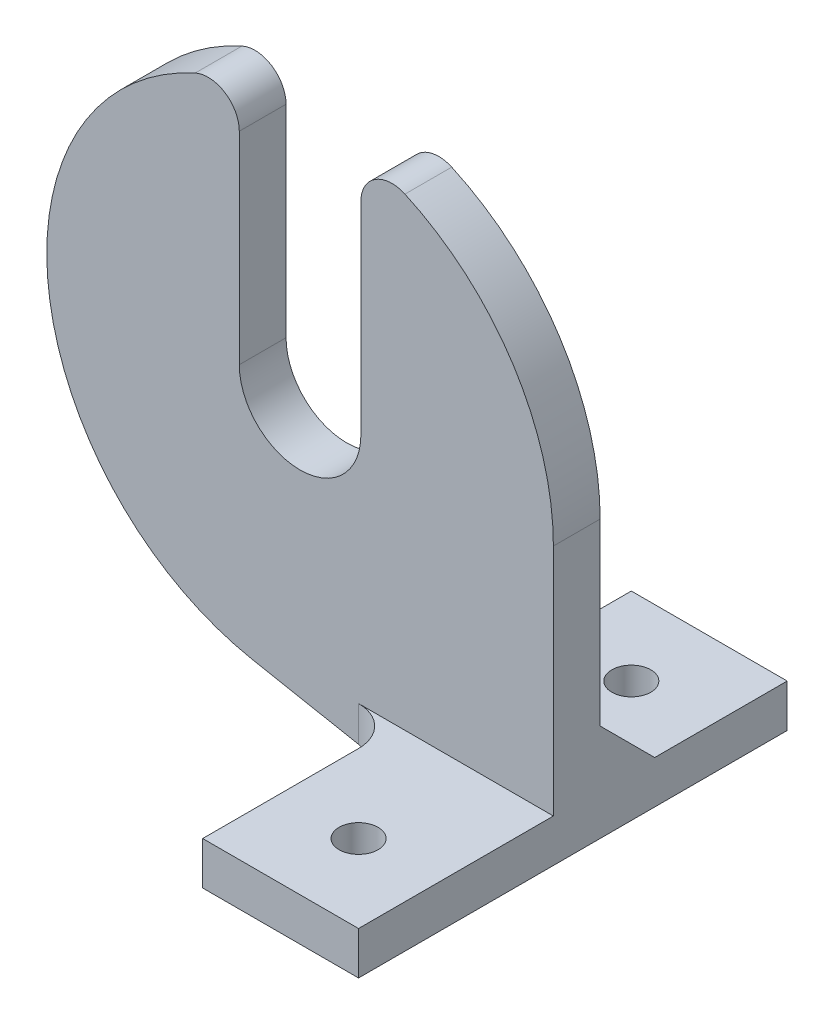
ISO-10303-21;
HEADER;
FILE_DESCRIPTION(('STEP AP214'),'2;1');
FILE_NAME('part.step','',(''),(''),'','','');
FILE_SCHEMA(('AUTOMOTIVE_DESIGN { 1 0 10303 214 1 1 1 1 }'));
ENDSEC;
DATA;
#1=APPLICATION_CONTEXT('core data for automotive mechanical design processes');
#2=APPLICATION_PROTOCOL_DEFINITION('international standard','automotive_design',2000,#1);
#3=PRODUCT_CONTEXT('',#1,'mechanical');
#4=PRODUCT('Part','Part','',(#3));
#5=PRODUCT_RELATED_PRODUCT_CATEGORY('part','',(#4));
#6=PRODUCT_DEFINITION_FORMATION('','',#4);
#7=PRODUCT_DEFINITION_CONTEXT('part definition',#1,'design');
#8=PRODUCT_DEFINITION('design','',#6,#7);
#9=PRODUCT_DEFINITION_SHAPE('','',#8);
#10=(LENGTH_UNIT() NAMED_UNIT(*) SI_UNIT(.MILLI.,.METRE.));
#11=(NAMED_UNIT(*) PLANE_ANGLE_UNIT() SI_UNIT($,.RADIAN.));
#12=(NAMED_UNIT(*) SI_UNIT($,.STERADIAN.) SOLID_ANGLE_UNIT());
#13=UNCERTAINTY_MEASURE_WITH_UNIT(LENGTH_MEASURE(1.E-05),#10,'distance_accuracy_value','');
#14=(GEOMETRIC_REPRESENTATION_CONTEXT(3) GLOBAL_UNCERTAINTY_ASSIGNED_CONTEXT((#13)) GLOBAL_UNIT_ASSIGNED_CONTEXT((#10,
#11,#12)) REPRESENTATION_CONTEXT('',''));
#15=CARTESIAN_POINT('',(0.,0.,0.));
#16=DIRECTION('',(0.,0.,1.));
#17=DIRECTION('',(1.,0.,0.));
#18=AXIS2_PLACEMENT_3D('',#15,#16,#17);
#19=CARTESIAN_POINT('',(0.,0.,7.62));
#20=DIRECTION('',(0.,0.,-1.));
#21=DIRECTION('',(-1.,0.,0.));
#22=AXIS2_PLACEMENT_3D('',#19,#20,#21);
#23=CYLINDRICAL_SURFACE('',#22,41.275);
#24=CARTESIAN_POINT('',(0.,0.,7.62));
#25=DIRECTION('',(0.,0.,1.));
#26=DIRECTION('',(1.,0.,0.));
#27=AXIS2_PLACEMENT_3D('',#24,#25,#26);
#28=CIRCLE('',#27,41.275);
#29=CARTESIAN_POINT('',(-17.089298245614,37.571019555935,7.62));
#30=VERTEX_POINT('',#29);
#31=CARTESIAN_POINT('',(-7.79603534004595,-40.5320546971993,7.62));
#32=VERTEX_POINT('',#31);
#33=EDGE_CURVE('E222',#30,#32,#28,.T.);
#34=ORIENTED_EDGE('',*,*,#33,.F.);
#35=DIRECTION('',(0.,0.,-1.));
#36=VECTOR('',#35,1.);
#37=CARTESIAN_POINT('',(-17.089298245614,37.571019555935,7.62));
#38=LINE('',#37,#36);
#39=CARTESIAN_POINT('',(-17.089298245614,37.571019555935,0.));
#40=VERTEX_POINT('',#39);
#41=EDGE_CURVE('E42',#30,#40,#38,.T.);
#42=ORIENTED_EDGE('',*,*,#41,.T.);
#43=CARTESIAN_POINT('',(0.,0.,0.));
#44=DIRECTION('',(0.,0.,1.));
#45=DIRECTION('',(1.,0.,0.));
#46=AXIS2_PLACEMENT_3D('',#43,#44,#45);
#47=CIRCLE('',#46,41.275);
#48=CARTESIAN_POINT('',(-7.79603534004595,-40.5320546971993,0.));
#49=VERTEX_POINT('',#48);
#50=EDGE_CURVE('E235',#40,#49,#47,.T.);
#51=ORIENTED_EDGE('',*,*,#50,.T.);
#52=DIRECTION('',(0.,0.,1.));
#53=VECTOR('',#52,1.);
#54=CARTESIAN_POINT('',(-7.79603534004595,-40.5320546971993,0.));
#55=LINE('',#54,#53);
#56=EDGE_CURVE('E186',#49,#32,#55,.T.);
#57=ORIENTED_EDGE('',*,*,#56,.T.);
#58=EDGE_LOOP('',(#34,#42,#51,#57));
#59=FACE_BOUND('',#58,.T.);
#60=ADVANCED_FACE('F34',(#59),#23,.T.);
#61=CARTESIAN_POINT('',(15.875,-38.1,-30.48));
#62=DIRECTION('',(-1.,0.,0.));
#63=DIRECTION('',(0.,0.,1.));
#64=AXIS2_PLACEMENT_3D('',#61,#62,#63);
#65=PLANE('',#64);
#66=DIRECTION('',(0.,0.,1.));
#67=VECTOR('',#66,1.);
#68=CARTESIAN_POINT('',(15.875,-45.085,-30.48));
#69=LINE('',#68,#67);
#70=CARTESIAN_POINT('',(15.875,-45.085,-30.48));
#71=VERTEX_POINT('',#70);
#72=CARTESIAN_POINT('',(15.875,-45.085,-6.35));
#73=VERTEX_POINT('',#72);
#74=EDGE_CURVE('E206',#71,#73,#69,.T.);
#75=ORIENTED_EDGE('',*,*,#74,.T.);
#76=DIRECTION('',(0.,1.,0.));
#77=VECTOR('',#76,1.);
#78=CARTESIAN_POINT('',(15.875,-29.2100000000001,-6.35));
#79=LINE('',#78,#77);
#80=CARTESIAN_POINT('',(15.875,-35.56,-6.35));
#81=VERTEX_POINT('',#80);
#82=EDGE_CURVE('E271',#73,#81,#79,.T.);
#83=ORIENTED_EDGE('',*,*,#82,.T.);
#84=DIRECTION('',(0.,0.707106781186544,0.707106781186551));
#85=VECTOR('',#84,1.);
#86=CARTESIAN_POINT('',(15.875,-38.1,-8.89000000000004));
#87=LINE('',#86,#85);
#88=CARTESIAN_POINT('',(15.875,-38.1,-8.89000000000004));
#89=VERTEX_POINT('',#88);
#90=EDGE_CURVE('E263',#81,#89,#87,.F.);
#91=ORIENTED_EDGE('',*,*,#90,.T.);
#92=DIRECTION('',(0.,0.,1.));
#93=VECTOR('',#92,1.);
#94=CARTESIAN_POINT('',(15.875,-38.1,-30.48));
#95=LINE('',#94,#93);
#96=CARTESIAN_POINT('',(15.875,-38.1,-30.48));
#97=VERTEX_POINT('',#96);
#98=EDGE_CURVE('E210',#97,#89,#95,.T.);
#99=ORIENTED_EDGE('',*,*,#98,.F.);
#100=DIRECTION('',(0.,-1.,0.));
#101=VECTOR('',#100,1.);
#102=CARTESIAN_POINT('',(15.875,-38.1,-30.48));
#103=LINE('',#102,#101);
#104=EDGE_CURVE('E198',#97,#71,#103,.T.);
#105=ORIENTED_EDGE('',*,*,#104,.T.);
#106=EDGE_LOOP('',(#75,#83,#91,#99,#105));
#107=FACE_BOUND('',#106,.T.);
#108=ADVANCED_FACE('F341',(#107),#65,.T.);
#109=CARTESIAN_POINT('',(0.,0.,7.62));
#110=DIRECTION('',(0.,0.,-1.));
#111=DIRECTION('',(-1.,0.,0.));
#112=AXIS2_PLACEMENT_3D('',#109,#110,#111);
#113=CYLINDRICAL_SURFACE('',#112,9.906);
#114=CARTESIAN_POINT('',(0.,0.,0.));
#115=DIRECTION('',(0.,0.,-1.));
#116=DIRECTION('',(-1.,0.,0.));
#117=AXIS2_PLACEMENT_3D('',#114,#115,#116);
#118=CIRCLE('',#117,9.906);
#119=CARTESIAN_POINT('',(9.906,0.,0.));
#120=VERTEX_POINT('',#119);
#121=CARTESIAN_POINT('',(-9.906,0.,0.));
#122=VERTEX_POINT('',#121);
#123=EDGE_CURVE('E215',#120,#122,#118,.T.);
#124=ORIENTED_EDGE('',*,*,#123,.T.);
#125=DIRECTION('',(0.,0.,-1.));
#126=VECTOR('',#125,1.);
#127=CARTESIAN_POINT('',(-9.906,0.,7.62));
#128=LINE('',#127,#126);
#129=CARTESIAN_POINT('',(-9.906,0.,7.62));
#130=VERTEX_POINT('',#129);
#131=EDGE_CURVE('E248',#130,#122,#128,.T.);
#132=ORIENTED_EDGE('',*,*,#131,.F.);
#133=CARTESIAN_POINT('',(0.,0.,7.62));
#134=DIRECTION('',(0.,0.,-1.));
#135=DIRECTION('',(-1.,0.,0.));
#136=AXIS2_PLACEMENT_3D('',#133,#134,#135);
#137=CIRCLE('',#136,9.906);
#138=CARTESIAN_POINT('',(9.906,0.,7.62));
#139=VERTEX_POINT('',#138);
#140=EDGE_CURVE('E216',#139,#130,#137,.T.);
#141=ORIENTED_EDGE('',*,*,#140,.F.);
#142=DIRECTION('',(0.,0.,-1.));
#143=VECTOR('',#142,1.);
#144=CARTESIAN_POINT('',(9.906,0.,7.62));
#145=LINE('',#144,#143);
#146=EDGE_CURVE('E230',#139,#120,#145,.T.);
#147=ORIENTED_EDGE('',*,*,#146,.T.);
#148=EDGE_LOOP('',(#124,#132,#141,#147));
#149=FACE_BOUND('',#148,.T.);
#150=ADVANCED_FACE('F351',(#149),#113,.F.);
#151=CARTESIAN_POINT('',(-9.906,0.,7.62));
#152=DIRECTION('',(-1.,0.,0.));
#153=DIRECTION('',(0.,0.,1.));
#154=AXIS2_PLACEMENT_3D('',#151,#152,#153);
#155=PLANE('',#154);
#156=DIRECTION('',(0.,1.,0.));
#157=VECTOR('',#156,1.);
#158=CARTESIAN_POINT('',(-9.906,0.,0.));
#159=LINE('',#158,#157);
#160=CARTESIAN_POINT('',(-9.906,32.9468940721276,0.));
#161=VERTEX_POINT('',#160);
#162=EDGE_CURVE('E233',#122,#161,#159,.T.);
#163=ORIENTED_EDGE('',*,*,#162,.T.);
#164=DIRECTION('',(0.,0.,-1.));
#165=VECTOR('',#164,1.);
#166=CARTESIAN_POINT('',(-9.906,32.9468940721276,7.62));
#167=LINE('',#166,#165);
#168=CARTESIAN_POINT('',(-9.906,32.9468940721276,7.62));
#169=VERTEX_POINT('',#168);
#170=EDGE_CURVE('E11',#161,#169,#167,.F.);
#171=ORIENTED_EDGE('',*,*,#170,.T.);
#172=DIRECTION('',(0.,1.,0.));
#173=VECTOR('',#172,1.);
#174=CARTESIAN_POINT('',(-9.906,0.,7.62));
#175=LINE('',#174,#173);
#176=EDGE_CURVE('E219',#130,#169,#175,.T.);
#177=ORIENTED_EDGE('',*,*,#176,.F.);
#178=ORIENTED_EDGE('',*,*,#131,.T.);
#179=EDGE_LOOP('',(#163,#171,#177,#178));
#180=FACE_BOUND('',#179,.T.);
#181=ADVANCED_FACE('F356',(#180),#155,.F.);
#182=CARTESIAN_POINT('',(41.275,0.,7.62));
#183=DIRECTION('',(-1.,0.,0.));
#184=DIRECTION('',(0.,-1.,0.));
#185=AXIS2_PLACEMENT_3D('',#182,#183,#184);
#186=PLANE('',#185);
#187=DIRECTION('',(0.,1.,0.));
#188=VECTOR('',#187,1.);
#189=CARTESIAN_POINT('',(41.275,0.,7.62));
#190=LINE('',#189,#188);
#191=CARTESIAN_POINT('',(41.275,-38.1,7.62));
#192=VERTEX_POINT('',#191);
#193=CARTESIAN_POINT('',(41.275,0.,7.62));
#194=VERTEX_POINT('',#193);
#195=EDGE_CURVE('E165',#192,#194,#190,.T.);
#196=ORIENTED_EDGE('',*,*,#195,.F.);
#197=DIRECTION('',(0.,0.,1.));
#198=VECTOR('',#197,1.);
#199=CARTESIAN_POINT('',(41.275,-38.1,-30.48));
#200=LINE('',#199,#198);
#201=CARTESIAN_POINT('',(41.275,-38.1,39.37));
#202=VERTEX_POINT('',#201);
#203=EDGE_CURVE('E159',#192,#202,#200,.T.);
#204=ORIENTED_EDGE('',*,*,#203,.T.);
#205=DIRECTION('',(0.,1.,0.));
#206=VECTOR('',#205,1.);
#207=CARTESIAN_POINT('',(41.275,-38.1,39.37));
#208=LINE('',#207,#206);
#209=CARTESIAN_POINT('',(41.275,-45.085,39.37));
#210=VERTEX_POINT('',#209);
#211=EDGE_CURVE('E163',#210,#202,#208,.T.);
#212=ORIENTED_EDGE('',*,*,#211,.F.);
#213=DIRECTION('',(0.,0.,1.));
#214=VECTOR('',#213,1.);
#215=CARTESIAN_POINT('',(41.275,-45.085,-30.48));
#216=LINE('',#215,#214);
#217=CARTESIAN_POINT('',(41.275,-45.085,-30.48));
#218=VERTEX_POINT('',#217);
#219=EDGE_CURVE('E203',#218,#210,#216,.T.);
#220=ORIENTED_EDGE('',*,*,#219,.F.);
#221=DIRECTION('',(0.,1.,0.));
#222=VECTOR('',#221,1.);
#223=CARTESIAN_POINT('',(41.275,-38.1,-30.48));
#224=LINE('',#223,#222);
#225=CARTESIAN_POINT('',(41.275,-38.1,-30.48));
#226=VERTEX_POINT('',#225);
#227=EDGE_CURVE('E192',#218,#226,#224,.T.);
#228=ORIENTED_EDGE('',*,*,#227,.T.);
#229=CARTESIAN_POINT('',(41.275,-38.1,-8.89000000000004));
#230=VERTEX_POINT('',#229);
#231=EDGE_CURVE('E167',#226,#230,#200,.T.);
#232=ORIENTED_EDGE('',*,*,#231,.T.);
#233=DIRECTION('',(0.,-0.707106781186544,-0.707106781186551));
#234=VECTOR('',#233,1.);
#235=CARTESIAN_POINT('',(41.275,-10.7950000000002,18.4150000000001));
#236=LINE('',#235,#234);
#237=CARTESIAN_POINT('',(41.275,-29.2100000000001,0.));
#238=VERTEX_POINT('',#237);
#239=EDGE_CURVE('E261',#230,#238,#236,.F.);
#240=ORIENTED_EDGE('',*,*,#239,.T.);
#241=DIRECTION('',(0.,1.,0.));
#242=VECTOR('',#241,1.);
#243=CARTESIAN_POINT('',(41.275,0.,0.));
#244=LINE('',#243,#242);
#245=CARTESIAN_POINT('',(41.275,0.,0.));
#246=VERTEX_POINT('',#245);
#247=EDGE_CURVE('E237',#238,#246,#244,.T.);
#248=ORIENTED_EDGE('',*,*,#247,.T.);
#249=DIRECTION('',(0.,0.,-1.));
#250=VECTOR('',#249,1.);
#251=CARTESIAN_POINT('',(41.275,0.,7.62));
#252=LINE('',#251,#250);
#253=EDGE_CURVE('E245',#194,#246,#252,.T.);
#254=ORIENTED_EDGE('',*,*,#253,.F.);
#255=EDGE_LOOP('',(#196,#204,#212,#220,#228,#232,#240,#248,#254));
#256=FACE_BOUND('',#255,.T.);
#257=ADVANCED_FACE('F161',(#256),#186,.F.);
#258=CARTESIAN_POINT('',(0.,0.,7.62));
#259=DIRECTION('',(0.,0.,-1.));
#260=DIRECTION('',(-1.,0.,0.));
#261=AXIS2_PLACEMENT_3D('',#258,#259,#260);
#262=CYLINDRICAL_SURFACE('',#261,41.275);
#263=CARTESIAN_POINT('',(0.,0.,0.));
#264=DIRECTION('',(0.,0.,1.));
#265=DIRECTION('',(1.,0.,0.));
#266=AXIS2_PLACEMENT_3D('',#263,#264,#265);
#267=CIRCLE('',#266,41.275);
#268=CARTESIAN_POINT('',(17.089298245614,37.571019555935,0.));
#269=VERTEX_POINT('',#268);
#270=EDGE_CURVE('E239',#246,#269,#267,.T.);
#271=ORIENTED_EDGE('',*,*,#270,.T.);
#272=DIRECTION('',(0.,0.,-1.));
#273=VECTOR('',#272,1.);
#274=CARTESIAN_POINT('',(17.089298245614,37.571019555935,7.62));
#275=LINE('',#274,#273);
#276=CARTESIAN_POINT('',(17.089298245614,37.571019555935,7.62));
#277=VERTEX_POINT('',#276);
#278=EDGE_CURVE('E293',#269,#277,#275,.F.);
#279=ORIENTED_EDGE('',*,*,#278,.T.);
#280=CARTESIAN_POINT('',(0.,0.,7.62));
#281=DIRECTION('',(0.,0.,1.));
#282=DIRECTION('',(1.,0.,0.));
#283=AXIS2_PLACEMENT_3D('',#280,#281,#282);
#284=CIRCLE('',#283,41.275);
#285=EDGE_CURVE('E225',#194,#277,#284,.T.);
#286=ORIENTED_EDGE('',*,*,#285,.F.);
#287=ORIENTED_EDGE('',*,*,#253,.T.);
#288=EDGE_LOOP('',(#271,#279,#286,#287));
#289=FACE_BOUND('',#288,.T.);
#290=ADVANCED_FACE('F394',(#289),#262,.T.);
#291=CARTESIAN_POINT('',(9.906,0.,7.62));
#292=DIRECTION('',(1.,0.,0.));
#293=DIRECTION('',(0.,0.,-1.));
#294=AXIS2_PLACEMENT_3D('',#291,#292,#293);
#295=PLANE('',#294);
#296=DIRECTION('',(0.,-1.,0.));
#297=VECTOR('',#296,1.);
#298=CARTESIAN_POINT('',(9.906,0.,7.62));
#299=LINE('',#298,#297);
#300=CARTESIAN_POINT('',(9.906,32.9468940721276,7.62));
#301=VERTEX_POINT('',#300);
#302=EDGE_CURVE('E228',#301,#139,#299,.T.);
#303=ORIENTED_EDGE('',*,*,#302,.F.);
#304=DIRECTION('',(0.,0.,-1.));
#305=VECTOR('',#304,1.);
#306=CARTESIAN_POINT('',(9.906,32.9468940721276,7.62));
#307=LINE('',#306,#305);
#308=CARTESIAN_POINT('',(9.906,32.9468940721276,0.));
#309=VERTEX_POINT('',#308);
#310=EDGE_CURVE('E286',#301,#309,#307,.T.);
#311=ORIENTED_EDGE('',*,*,#310,.T.);
#312=DIRECTION('',(0.,-1.,0.));
#313=VECTOR('',#312,1.);
#314=CARTESIAN_POINT('',(9.906,0.,0.));
#315=LINE('',#314,#313);
#316=EDGE_CURVE('E220',#309,#120,#315,.T.);
#317=ORIENTED_EDGE('',*,*,#316,.T.);
#318=ORIENTED_EDGE('',*,*,#146,.F.);
#319=EDGE_LOOP('',(#303,#311,#317,#318));
#320=FACE_BOUND('',#319,.T.);
#321=ADVANCED_FACE('F387',(#320),#295,.F.);
#322=CARTESIAN_POINT('',(0.,0.,7.62));
#323=DIRECTION('',(0.,0.,-1.));
#324=DIRECTION('',(-1.,0.,0.));
#325=AXIS2_PLACEMENT_3D('',#322,#323,#324);
#326=PLANE('',#325);
#327=ORIENTED_EDGE('',*,*,#285,.T.);
#328=CARTESIAN_POINT('',(14.986,32.9468940721276,7.62));
#329=DIRECTION('',(0.,0.,-1.));
#330=DIRECTION('',(-1.,0.,0.));
#331=AXIS2_PLACEMENT_3D('',#328,#329,#330);
#332=CIRCLE('',#331,5.08);
#333=EDGE_CURVE('E296',#277,#301,#332,.F.);
#334=ORIENTED_EDGE('',*,*,#333,.T.);
#335=ORIENTED_EDGE('',*,*,#302,.T.);
#336=ORIENTED_EDGE('',*,*,#140,.T.);
#337=ORIENTED_EDGE('',*,*,#176,.T.);
#338=CARTESIAN_POINT('',(-14.986,32.9468940721276,7.62));
#339=DIRECTION('',(0.,0.,-1.));
#340=DIRECTION('',(-1.,0.,0.));
#341=AXIS2_PLACEMENT_3D('',#338,#339,#340);
#342=CIRCLE('',#341,5.08);
#343=EDGE_CURVE('E49',#169,#30,#342,.F.);
#344=ORIENTED_EDGE('',*,*,#343,.T.);
#345=ORIENTED_EDGE('',*,*,#33,.T.);
#346=DIRECTION('',(0.982000113802527,-0.188880323199175,0.));
#347=VECTOR('',#346,1.);
#348=CARTESIAN_POINT('',(15.875,-45.085,7.62));
#349=LINE('',#348,#347);
#350=CARTESIAN_POINT('',(9.52500000000001,-43.8636253428521,7.62));
#351=VERTEX_POINT('',#350);
#352=EDGE_CURVE('E255',#32,#351,#349,.T.);
#353=ORIENTED_EDGE('',*,*,#352,.T.);
#354=DIRECTION('',(0.,1.,0.));
#355=VECTOR('',#354,1.);
#356=CARTESIAN_POINT('',(9.52500000000001,0.,7.62));
#357=LINE('',#356,#355);
#358=CARTESIAN_POINT('',(9.52500000000001,-38.1,7.62));
#359=VERTEX_POINT('',#358);
#360=EDGE_CURVE('E265',#351,#359,#357,.T.);
#361=ORIENTED_EDGE('',*,*,#360,.T.);
#362=DIRECTION('',(1.,0.,0.));
#363=VECTOR('',#362,1.);
#364=CARTESIAN_POINT('',(0.,-38.1,7.62));
#365=LINE('',#364,#363);
#366=EDGE_CURVE('E205',#359,#192,#365,.T.);
#367=ORIENTED_EDGE('',*,*,#366,.T.);
#368=ORIENTED_EDGE('',*,*,#195,.T.);
#369=EDGE_LOOP('',(#327,#334,#335,#336,#337,#344,#345,#353,#361,#367,#368));
#370=FACE_BOUND('',#369,.T.);
#371=ADVANCED_FACE('F383',(#370),#326,.F.);
#372=CARTESIAN_POINT('',(0.,0.,0.));
#373=DIRECTION('',(0.,0.,-1.));
#374=DIRECTION('',(-1.,0.,0.));
#375=AXIS2_PLACEMENT_3D('',#372,#373,#374);
#376=PLANE('',#375);
#377=ORIENTED_EDGE('',*,*,#316,.F.);
#378=CARTESIAN_POINT('',(14.986,32.9468940721276,0.));
#379=DIRECTION('',(0.,0.,-1.));
#380=DIRECTION('',(-1.,0.,0.));
#381=AXIS2_PLACEMENT_3D('',#378,#379,#380);
#382=CIRCLE('',#381,5.08);
#383=EDGE_CURVE('E291',#309,#269,#382,.T.);
#384=ORIENTED_EDGE('',*,*,#383,.T.);
#385=ORIENTED_EDGE('',*,*,#270,.F.);
#386=ORIENTED_EDGE('',*,*,#247,.F.);
#387=DIRECTION('',(-1.,0.,0.));
#388=VECTOR('',#387,1.);
#389=CARTESIAN_POINT('',(15.875,-29.2100000000001,0.));
#390=LINE('',#389,#388);
#391=CARTESIAN_POINT('',(9.52500000000001,-29.2100000000001,0.));
#392=VERTEX_POINT('',#391);
#393=EDGE_CURVE('E259',#238,#392,#390,.T.);
#394=ORIENTED_EDGE('',*,*,#393,.T.);
#395=DIRECTION('',(0.,1.,0.));
#396=VECTOR('',#395,1.);
#397=CARTESIAN_POINT('',(9.52500000000001,-45.085,0.));
#398=LINE('',#397,#396);
#399=CARTESIAN_POINT('',(9.52500000000001,-43.8636253428521,0.));
#400=VERTEX_POINT('',#399);
#401=EDGE_CURVE('E274',#392,#400,#398,.F.);
#402=ORIENTED_EDGE('',*,*,#401,.T.);
#403=DIRECTION('',(0.982000113802527,-0.188880323199175,0.));
#404=VECTOR('',#403,1.);
#405=CARTESIAN_POINT('',(15.875,-45.085,0.));
#406=LINE('',#405,#404);
#407=EDGE_CURVE('E309',#49,#400,#406,.T.);
#408=ORIENTED_EDGE('',*,*,#407,.F.);
#409=ORIENTED_EDGE('',*,*,#50,.F.);
#410=CARTESIAN_POINT('',(-14.986,32.9468940721276,0.));
#411=DIRECTION('',(0.,0.,-1.));
#412=DIRECTION('',(-1.,0.,0.));
#413=AXIS2_PLACEMENT_3D('',#410,#411,#412);
#414=CIRCLE('',#413,5.08);
#415=EDGE_CURVE('E289',#40,#161,#414,.T.);
#416=ORIENTED_EDGE('',*,*,#415,.T.);
#417=ORIENTED_EDGE('',*,*,#162,.F.);
#418=ORIENTED_EDGE('',*,*,#123,.F.);
#419=EDGE_LOOP('',(#377,#384,#385,#386,#394,#402,#408,#409,#416,#417,#418));
#420=FACE_BOUND('',#419,.T.);
#421=ADVANCED_FACE('F307',(#420),#376,.T.);
#422=CARTESIAN_POINT('',(15.875,-38.1,13.97));
#423=VERTEX_POINT('',#422);
#424=CARTESIAN_POINT('',(15.875,-38.1,39.37));
#425=VERTEX_POINT('',#424);
#426=EDGE_CURVE('E174',#423,#425,#95,.T.);
#427=ORIENTED_EDGE('',*,*,#426,.F.);
#428=DIRECTION('',(0.,1.,0.));
#429=VECTOR('',#428,1.);
#430=CARTESIAN_POINT('',(15.875,-38.1,13.97));
#431=LINE('',#430,#429);
#432=CARTESIAN_POINT('',(15.875,-45.085,13.97));
#433=VERTEX_POINT('',#432);
#434=EDGE_CURVE('E268',#423,#433,#431,.F.);
#435=ORIENTED_EDGE('',*,*,#434,.T.);
#436=CARTESIAN_POINT('',(15.875,-45.085,39.37));
#437=VERTEX_POINT('',#436);
#438=EDGE_CURVE('E209',#433,#437,#69,.T.);
#439=ORIENTED_EDGE('',*,*,#438,.T.);
#440=DIRECTION('',(0.,-1.,0.));
#441=VECTOR('',#440,1.);
#442=CARTESIAN_POINT('',(15.875,-38.1,39.37));
#443=LINE('',#442,#441);
#444=EDGE_CURVE('E178',#425,#437,#443,.T.);
#445=ORIENTED_EDGE('',*,*,#444,.F.);
#446=EDGE_LOOP('',(#427,#435,#439,#445));
#447=FACE_BOUND('',#446,.T.);
#448=ADVANCED_FACE('F330',(#447),#65,.T.);
#449=CARTESIAN_POINT('',(41.275,-38.1,-30.48));
#450=DIRECTION('',(0.,1.,0.));
#451=DIRECTION('',(0.,0.,1.));
#452=AXIS2_PLACEMENT_3D('',#449,#450,#451);
#453=PLANE('',#452);
#454=CARTESIAN_POINT('',(28.575,-38.1,26.67));
#455=DIRECTION('',(0.,1.,0.));
#456=DIRECTION('',(0.,0.,1.));
#457=AXIS2_PLACEMENT_3D('',#454,#455,#456);
#458=CIRCLE('',#457,3.175);
#459=CARTESIAN_POINT('',(28.575,-38.1,29.845));
#460=VERTEX_POINT('',#459);
#461=EDGE_CURVE('E319',#460,#460,#458,.T.);
#462=ORIENTED_EDGE('',*,*,#461,.F.);
#463=EDGE_LOOP('',(#462));
#464=FACE_BOUND('',#463,.T.);
#465=ORIENTED_EDGE('',*,*,#366,.F.);
#466=CARTESIAN_POINT('',(9.52500000000001,-38.1,13.97));
#467=DIRECTION('',(0.,1.,0.));
#468=DIRECTION('',(0.,0.,1.));
#469=AXIS2_PLACEMENT_3D('',#466,#467,#468);
#470=CIRCLE('',#469,6.35);
#471=EDGE_CURVE('E276',#359,#423,#470,.F.);
#472=ORIENTED_EDGE('',*,*,#471,.T.);
#473=ORIENTED_EDGE('',*,*,#426,.T.);
#474=DIRECTION('',(-1.,0.,0.));
#475=VECTOR('',#474,1.);
#476=CARTESIAN_POINT('',(41.275,-38.1,39.37));
#477=LINE('',#476,#475);
#478=EDGE_CURVE('E171',#202,#425,#477,.T.);
#479=ORIENTED_EDGE('',*,*,#478,.F.);
#480=ORIENTED_EDGE('',*,*,#203,.F.);
#481=EDGE_LOOP('',(#465,#472,#473,#479,#480));
#482=FACE_BOUND('',#481,.T.);
#483=ADVANCED_FACE('F172',(#464,#482),#453,.T.);
#484=CARTESIAN_POINT('',(41.275,-45.085,-30.48));
#485=DIRECTION('',(0.,-1.,0.));
#486=DIRECTION('',(0.,0.,-1.));
#487=AXIS2_PLACEMENT_3D('',#484,#485,#486);
#488=PLANE('',#487);
#489=CARTESIAN_POINT('',(28.575,-45.085,26.67));
#490=DIRECTION('',(0.,-1.,0.));
#491=DIRECTION('',(0.,0.,-1.));
#492=AXIS2_PLACEMENT_3D('',#489,#490,#491);
#493=CIRCLE('',#492,3.175);
#494=CARTESIAN_POINT('',(28.575,-45.085,29.845));
#495=VERTEX_POINT('',#494);
#496=EDGE_CURVE('E252',#495,#495,#493,.T.);
#497=ORIENTED_EDGE('',*,*,#496,.F.);
#498=EDGE_LOOP('',(#497));
#499=FACE_BOUND('',#498,.T.);
#500=CARTESIAN_POINT('',(28.575,-45.085,-17.78));
#501=DIRECTION('',(0.,-1.,0.));
#502=DIRECTION('',(0.,0.,-1.));
#503=AXIS2_PLACEMENT_3D('',#500,#501,#502);
#504=CIRCLE('',#503,3.175);
#505=CARTESIAN_POINT('',(28.575,-45.085,-14.605));
#506=VERTEX_POINT('',#505);
#507=EDGE_CURVE('E256',#506,#506,#504,.T.);
#508=ORIENTED_EDGE('',*,*,#507,.F.);
#509=EDGE_LOOP('',(#508));
#510=FACE_BOUND('',#509,.T.);
#511=ORIENTED_EDGE('',*,*,#219,.T.);
#512=DIRECTION('',(1.,0.,0.));
#513=VECTOR('',#512,1.);
#514=CARTESIAN_POINT('',(41.275,-45.085,39.37));
#515=LINE('',#514,#513);
#516=EDGE_CURVE('E183',#437,#210,#515,.T.);
#517=ORIENTED_EDGE('',*,*,#516,.F.);
#518=ORIENTED_EDGE('',*,*,#438,.F.);
#519=DIRECTION('',(0.,0.,1.));
#520=VECTOR('',#519,1.);
#521=CARTESIAN_POINT('',(15.875,-45.085,0.));
#522=LINE('',#521,#520);
#523=EDGE_CURVE('E184',#73,#433,#522,.T.);
#524=ORIENTED_EDGE('',*,*,#523,.F.);
#525=ORIENTED_EDGE('',*,*,#74,.F.);
#526=DIRECTION('',(1.,0.,0.));
#527=VECTOR('',#526,1.);
#528=CARTESIAN_POINT('',(41.275,-45.085,-30.48));
#529=LINE('',#528,#527);
#530=EDGE_CURVE('E168',#71,#218,#529,.T.);
#531=ORIENTED_EDGE('',*,*,#530,.T.);
#532=EDGE_LOOP('',(#511,#517,#518,#524,#525,#531));
#533=FACE_BOUND('',#532,.T.);
#534=ADVANCED_FACE('F329',(#499,#510,#533),#488,.T.);
#535=CARTESIAN_POINT('',(28.575,-38.1,-17.78));
#536=DIRECTION('',(0.,1.,0.));
#537=DIRECTION('',(0.,0.,1.));
#538=AXIS2_PLACEMENT_3D('',#535,#536,#537);
#539=CIRCLE('',#538,3.175);
#540=CARTESIAN_POINT('',(28.575,-38.1,-14.605));
#541=VERTEX_POINT('',#540);
#542=EDGE_CURVE('E320',#541,#541,#539,.T.);
#543=ORIENTED_EDGE('',*,*,#542,.F.);
#544=EDGE_LOOP('',(#543));
#545=FACE_BOUND('',#544,.T.);
#546=ORIENTED_EDGE('',*,*,#98,.T.);
#547=DIRECTION('',(1.,0.,0.));
#548=VECTOR('',#547,1.);
#549=CARTESIAN_POINT('',(41.275,-38.1,-8.89000000000004));
#550=LINE('',#549,#548);
#551=EDGE_CURVE('E251',#89,#230,#550,.T.);
#552=ORIENTED_EDGE('',*,*,#551,.T.);
#553=ORIENTED_EDGE('',*,*,#231,.F.);
#554=DIRECTION('',(-1.,0.,0.));
#555=VECTOR('',#554,1.);
#556=CARTESIAN_POINT('',(41.275,-38.1,-30.48));
#557=LINE('',#556,#555);
#558=EDGE_CURVE('E195',#226,#97,#557,.T.);
#559=ORIENTED_EDGE('',*,*,#558,.T.);
#560=EDGE_LOOP('',(#546,#552,#553,#559));
#561=FACE_BOUND('',#560,.T.);
#562=ADVANCED_FACE('F332',(#545,#561),#453,.T.);
#563=CARTESIAN_POINT('',(0.,0.,-30.48));
#564=DIRECTION('',(0.,0.,-1.));
#565=DIRECTION('',(-1.,0.,0.));
#566=AXIS2_PLACEMENT_3D('',#563,#564,#565);
#567=PLANE('',#566);
#568=ORIENTED_EDGE('',*,*,#227,.F.);
#569=ORIENTED_EDGE('',*,*,#530,.F.);
#570=ORIENTED_EDGE('',*,*,#104,.F.);
#571=ORIENTED_EDGE('',*,*,#558,.F.);
#572=EDGE_LOOP('',(#568,#569,#570,#571));
#573=FACE_BOUND('',#572,.T.);
#574=ADVANCED_FACE('F344',(#573),#567,.T.);
#575=CARTESIAN_POINT('',(0.,0.,39.37));
#576=DIRECTION('',(0.,0.,-1.));
#577=DIRECTION('',(-1.,0.,0.));
#578=AXIS2_PLACEMENT_3D('',#575,#576,#577);
#579=PLANE('',#578);
#580=ORIENTED_EDGE('',*,*,#211,.T.);
#581=ORIENTED_EDGE('',*,*,#478,.T.);
#582=ORIENTED_EDGE('',*,*,#444,.T.);
#583=ORIENTED_EDGE('',*,*,#516,.T.);
#584=EDGE_LOOP('',(#580,#581,#582,#583));
#585=FACE_BOUND('',#584,.T.);
#586=ADVANCED_FACE('F181',(#585),#579,.F.);
#587=CARTESIAN_POINT('',(15.875,-45.085,0.));
#588=DIRECTION('',(-0.188880323199175,-0.982000113802527,0.));
#589=DIRECTION('',(0.982000113802527,-0.188880323199175,0.));
#590=AXIS2_PLACEMENT_3D('',#587,#588,#589);
#591=PLANE('',#590);
#592=ORIENTED_EDGE('',*,*,#352,.F.);
#593=ORIENTED_EDGE('',*,*,#56,.F.);
#594=ORIENTED_EDGE('',*,*,#407,.T.);
#595=CARTESIAN_POINT('',(9.52500000000001,-43.8636253428521,-6.35));
#596=DIRECTION('',(-0.188880323199175,-0.982000113802527,0.));
#597=DIRECTION('',(0.982000113802527,-0.188880323199175,0.));
#598=AXIS2_PLACEMENT_3D('',#595,#596,#597);
#599=ELLIPSE('',#598,6.46639436263542,6.35);
#600=EDGE_CURVE('E283',#400,#73,#599,.F.);
#601=ORIENTED_EDGE('',*,*,#600,.T.);
#602=ORIENTED_EDGE('',*,*,#523,.T.);
#603=CARTESIAN_POINT('',(9.52500000000001,-43.8636253428521,13.97));
#604=DIRECTION('',(-0.188880323199175,-0.982000113802527,0.));
#605=DIRECTION('',(-0.982000113802527,0.188880323199175,0.));
#606=AXIS2_PLACEMENT_3D('',#603,#604,#605);
#607=ELLIPSE('',#606,6.46639436263542,6.35);
#608=EDGE_CURVE('E278',#433,#351,#607,.F.);
#609=ORIENTED_EDGE('',*,*,#608,.T.);
#610=EDGE_LOOP('',(#592,#593,#594,#601,#602,#609));
#611=FACE_BOUND('',#610,.T.);
#612=ADVANCED_FACE('F400',(#611),#591,.T.);
#613=CARTESIAN_POINT('',(28.575,-45.72,-17.78));
#614=DIRECTION('',(0.,1.,0.));
#615=DIRECTION('',(0.,0.,1.));
#616=AXIS2_PLACEMENT_3D('',#613,#614,#615);
#617=CYLINDRICAL_SURFACE('',#616,3.175);
#618=CARTESIAN_POINT('',(28.575,-45.085,-14.605));
#619=CARTESIAN_POINT('',(28.575,-45.0122395833333,-14.605));
#620=CARTESIAN_POINT('',(28.575,-44.9394791666667,-14.605));
#621=CARTESIAN_POINT('',(28.575,-44.7939583333333,-14.605));
#622=CARTESIAN_POINT('',(28.575,-44.7211979166667,-14.605));
#623=CARTESIAN_POINT('',(28.575,-44.5756770833333,-14.605));
#624=CARTESIAN_POINT('',(28.575,-44.5029166666667,-14.605));
#625=CARTESIAN_POINT('',(28.575,-44.3573958333333,-14.605));
#626=CARTESIAN_POINT('',(28.575,-44.2846354166667,-14.605));
#627=CARTESIAN_POINT('',(28.575,-44.1391145833333,-14.605));
#628=CARTESIAN_POINT('',(28.575,-44.0663541666667,-14.605));
#629=CARTESIAN_POINT('',(28.575,-43.9208333333333,-14.605));
#630=CARTESIAN_POINT('',(28.575,-43.8480729166667,-14.605));
#631=CARTESIAN_POINT('',(28.575,-43.7025520833333,-14.605));
#632=CARTESIAN_POINT('',(28.575,-43.6297916666667,-14.605));
#633=CARTESIAN_POINT('',(28.575,-43.4842708333333,-14.605));
#634=CARTESIAN_POINT('',(28.575,-43.4115104166667,-14.605));
#635=CARTESIAN_POINT('',(28.575,-43.2659895833333,-14.605));
#636=CARTESIAN_POINT('',(28.575,-43.1932291666667,-14.605));
#637=CARTESIAN_POINT('',(28.575,-43.0477083333333,-14.605));
#638=CARTESIAN_POINT('',(28.575,-42.9749479166667,-14.605));
#639=CARTESIAN_POINT('',(28.575,-42.8294270833333,-14.605));
#640=CARTESIAN_POINT('',(28.575,-42.7566666666667,-14.605));
#641=CARTESIAN_POINT('',(28.575,-42.6111458333333,-14.605));
#642=CARTESIAN_POINT('',(28.575,-42.5383854166667,-14.605));
#643=CARTESIAN_POINT('',(28.575,-42.3928645833333,-14.605));
#644=CARTESIAN_POINT('',(28.575,-42.3201041666667,-14.605));
#645=CARTESIAN_POINT('',(28.575,-42.1745833333333,-14.605));
#646=CARTESIAN_POINT('',(28.575,-42.1018229166667,-14.605));
#647=CARTESIAN_POINT('',(28.575,-41.9563020833333,-14.605));
#648=CARTESIAN_POINT('',(28.575,-41.8835416666667,-14.605));
#649=CARTESIAN_POINT('',(28.575,-41.7380208333333,-14.605));
#650=CARTESIAN_POINT('',(28.575,-41.6652604166667,-14.605));
#651=CARTESIAN_POINT('',(28.575,-41.5197395833333,-14.605));
#652=CARTESIAN_POINT('',(28.575,-41.4469791666667,-14.605));
#653=CARTESIAN_POINT('',(28.575,-41.3014583333333,-14.605));
#654=CARTESIAN_POINT('',(28.575,-41.2286979166667,-14.605));
#655=CARTESIAN_POINT('',(28.575,-41.0831770833333,-14.605));
#656=CARTESIAN_POINT('',(28.575,-41.0104166666667,-14.605));
#657=CARTESIAN_POINT('',(28.575,-40.8648958333333,-14.605));
#658=CARTESIAN_POINT('',(28.575,-40.7921354166667,-14.605));
#659=CARTESIAN_POINT('',(28.575,-40.6466145833333,-14.605));
#660=CARTESIAN_POINT('',(28.575,-40.5738541666667,-14.605));
#661=CARTESIAN_POINT('',(28.575,-40.4283333333333,-14.605));
#662=CARTESIAN_POINT('',(28.575,-40.3555729166667,-14.605));
#663=CARTESIAN_POINT('',(28.575,-40.2100520833333,-14.605));
#664=CARTESIAN_POINT('',(28.575,-40.1372916666667,-14.605));
#665=CARTESIAN_POINT('',(28.575,-39.9917708333333,-14.605));
#666=CARTESIAN_POINT('',(28.575,-39.9190104166667,-14.605));
#667=CARTESIAN_POINT('',(28.575,-39.7734895833333,-14.605));
#668=CARTESIAN_POINT('',(28.575,-39.7007291666667,-14.605));
#669=CARTESIAN_POINT('',(28.575,-39.5552083333333,-14.605));
#670=CARTESIAN_POINT('',(28.575,-39.4824479166667,-14.605));
#671=CARTESIAN_POINT('',(28.575,-39.3369270833334,-14.605));
#672=CARTESIAN_POINT('',(28.575,-39.2641666666667,-14.605));
#673=CARTESIAN_POINT('',(28.575,-39.1186458333333,-14.605));
#674=CARTESIAN_POINT('',(28.575,-39.0458854166667,-14.605));
#675=CARTESIAN_POINT('',(28.575,-38.9003645833333,-14.605));
#676=CARTESIAN_POINT('',(28.575,-38.8276041666667,-14.605));
#677=CARTESIAN_POINT('',(28.575,-38.6820833333333,-14.605));
#678=CARTESIAN_POINT('',(28.575,-38.6093229166667,-14.605));
#679=CARTESIAN_POINT('',(28.575,-38.4638020833333,-14.605));
#680=CARTESIAN_POINT('',(28.575,-38.3910416666667,-14.605));
#681=CARTESIAN_POINT('',(28.575,-38.2455208333334,-14.605));
#682=CARTESIAN_POINT('',(28.575,-38.1727604166667,-14.605));
#683=CARTESIAN_POINT('',(28.575,-38.1,-14.605));
#684=B_SPLINE_CURVE_WITH_KNOTS('',3,(#618,#619,#620,#621,#622,#623,#624,#625,#626,#627,#628,
#629,#630,#631,#632,#633,#634,#635,#636,#637,#638,#639,#640,#641,#642,#643,#644,#645,#646,#647,
#648,#649,#650,#651,#652,#653,#654,#655,#656,#657,#658,#659,#660,#661,#662,#663,#664,#665,#666,
#667,#668,#669,#670,#671,#672,#673,#674,#675,#676,#677,#678,#679,#680,#681,#682,#683),
.UNSPECIFIED.,.F.,.F.,(4,2,2,2,2,2,2,2,2,2,2,2,2,2,2,2,2,2,2,2,2,2,2,2,2,2,2,2,2,2,2,2,4),(0.,
0.218281249999994,0.436562499999994,0.654843749999995,0.873124999999995,1.09140625,1.3096875,
1.52796874999999,1.74624999999999,1.96453124999999,2.18281249999999,2.40109374999999,
2.61937499999999,2.83765624999999,3.05593749999999,3.27421874999999,3.49249999999999,
3.71078124999999,3.92906249999999,4.14734374999998,4.36562499999998,4.58390624999998,
4.80218749999999,5.02046874999999,5.23874999999999,5.45703124999999,5.67531249999998,
5.89359374999998,6.11187499999998,6.33015624999998,6.54843749999998,6.76671874999998,
6.98499999999998),.UNSPECIFIED.);
#685=EDGE_CURVE('BSEAM422',#506,#541,#684,.T.);
#686=ORIENTED_EDGE('',*,*,#507,.T.);
#687=ORIENTED_EDGE('',*,*,#542,.T.);
#688=ORIENTED_EDGE('',*,*,#685,.T.);
#689=ORIENTED_EDGE('',*,*,#685,.F.);
#690=EDGE_LOOP('',(#686,#688,#687,#689));
#691=FACE_BOUND('',#690,.T.);
#692=ADVANCED_FACE('F422',(#691),#617,.F.);
#693=CARTESIAN_POINT('',(28.575,-45.72,26.67));
#694=DIRECTION('',(0.,1.,0.));
#695=DIRECTION('',(0.,0.,1.));
#696=AXIS2_PLACEMENT_3D('',#693,#694,#695);
#697=CYLINDRICAL_SURFACE('',#696,3.175);
#698=CARTESIAN_POINT('',(28.575,-45.085,29.845));
#699=CARTESIAN_POINT('',(28.575,-45.0122395833333,29.845));
#700=CARTESIAN_POINT('',(28.575,-44.9394791666667,29.845));
#701=CARTESIAN_POINT('',(28.575,-44.7939583333333,29.845));
#702=CARTESIAN_POINT('',(28.575,-44.7211979166667,29.845));
#703=CARTESIAN_POINT('',(28.575,-44.5756770833333,29.845));
#704=CARTESIAN_POINT('',(28.575,-44.5029166666667,29.845));
#705=CARTESIAN_POINT('',(28.575,-44.3573958333333,29.845));
#706=CARTESIAN_POINT('',(28.575,-44.2846354166667,29.845));
#707=CARTESIAN_POINT('',(28.575,-44.1391145833333,29.845));
#708=CARTESIAN_POINT('',(28.575,-44.0663541666667,29.845));
#709=CARTESIAN_POINT('',(28.575,-43.9208333333333,29.845));
#710=CARTESIAN_POINT('',(28.575,-43.8480729166667,29.845));
#711=CARTESIAN_POINT('',(28.575,-43.7025520833333,29.845));
#712=CARTESIAN_POINT('',(28.575,-43.6297916666667,29.845));
#713=CARTESIAN_POINT('',(28.575,-43.4842708333333,29.845));
#714=CARTESIAN_POINT('',(28.575,-43.4115104166667,29.845));
#715=CARTESIAN_POINT('',(28.575,-43.2659895833333,29.845));
#716=CARTESIAN_POINT('',(28.575,-43.1932291666667,29.845));
#717=CARTESIAN_POINT('',(28.575,-43.0477083333333,29.845));
#718=CARTESIAN_POINT('',(28.575,-42.9749479166667,29.845));
#719=CARTESIAN_POINT('',(28.575,-42.8294270833333,29.845));
#720=CARTESIAN_POINT('',(28.575,-42.7566666666667,29.845));
#721=CARTESIAN_POINT('',(28.575,-42.6111458333333,29.845));
#722=CARTESIAN_POINT('',(28.575,-42.5383854166667,29.845));
#723=CARTESIAN_POINT('',(28.575,-42.3928645833333,29.845));
#724=CARTESIAN_POINT('',(28.575,-42.3201041666667,29.845));
#725=CARTESIAN_POINT('',(28.575,-42.1745833333333,29.845));
#726=CARTESIAN_POINT('',(28.575,-42.1018229166667,29.845));
#727=CARTESIAN_POINT('',(28.575,-41.9563020833333,29.845));
#728=CARTESIAN_POINT('',(28.575,-41.8835416666667,29.845));
#729=CARTESIAN_POINT('',(28.575,-41.7380208333333,29.845));
#730=CARTESIAN_POINT('',(28.575,-41.6652604166667,29.845));
#731=CARTESIAN_POINT('',(28.575,-41.5197395833333,29.845));
#732=CARTESIAN_POINT('',(28.575,-41.4469791666667,29.845));
#733=CARTESIAN_POINT('',(28.575,-41.3014583333333,29.845));
#734=CARTESIAN_POINT('',(28.575,-41.2286979166667,29.845));
#735=CARTESIAN_POINT('',(28.575,-41.0831770833333,29.845));
#736=CARTESIAN_POINT('',(28.575,-41.0104166666667,29.845));
#737=CARTESIAN_POINT('',(28.575,-40.8648958333333,29.845));
#738=CARTESIAN_POINT('',(28.575,-40.7921354166667,29.845));
#739=CARTESIAN_POINT('',(28.575,-40.6466145833333,29.845));
#740=CARTESIAN_POINT('',(28.575,-40.5738541666667,29.845));
#741=CARTESIAN_POINT('',(28.575,-40.4283333333333,29.845));
#742=CARTESIAN_POINT('',(28.575,-40.3555729166667,29.845));
#743=CARTESIAN_POINT('',(28.575,-40.2100520833333,29.845));
#744=CARTESIAN_POINT('',(28.575,-40.1372916666667,29.845));
#745=CARTESIAN_POINT('',(28.575,-39.9917708333333,29.845));
#746=CARTESIAN_POINT('',(28.575,-39.9190104166667,29.845));
#747=CARTESIAN_POINT('',(28.575,-39.7734895833333,29.845));
#748=CARTESIAN_POINT('',(28.575,-39.7007291666667,29.845));
#749=CARTESIAN_POINT('',(28.575,-39.5552083333333,29.845));
#750=CARTESIAN_POINT('',(28.575,-39.4824479166667,29.845));
#751=CARTESIAN_POINT('',(28.575,-39.3369270833334,29.845));
#752=CARTESIAN_POINT('',(28.575,-39.2641666666667,29.845));
#753=CARTESIAN_POINT('',(28.575,-39.1186458333333,29.845));
#754=CARTESIAN_POINT('',(28.575,-39.0458854166667,29.845));
#755=CARTESIAN_POINT('',(28.575,-38.9003645833333,29.845));
#756=CARTESIAN_POINT('',(28.575,-38.8276041666667,29.845));
#757=CARTESIAN_POINT('',(28.575,-38.6820833333333,29.845));
#758=CARTESIAN_POINT('',(28.575,-38.6093229166667,29.845));
#759=CARTESIAN_POINT('',(28.575,-38.4638020833333,29.845));
#760=CARTESIAN_POINT('',(28.575,-38.3910416666667,29.845));
#761=CARTESIAN_POINT('',(28.575,-38.2455208333334,29.845));
#762=CARTESIAN_POINT('',(28.575,-38.1727604166667,29.845));
#763=CARTESIAN_POINT('',(28.575,-38.1,29.845));
#764=B_SPLINE_CURVE_WITH_KNOTS('',3,(#698,#699,#700,#701,#702,#703,#704,#705,#706,#707,#708,
#709,#710,#711,#712,#713,#714,#715,#716,#717,#718,#719,#720,#721,#722,#723,#724,#725,#726,#727,
#728,#729,#730,#731,#732,#733,#734,#735,#736,#737,#738,#739,#740,#741,#742,#743,#744,#745,#746,
#747,#748,#749,#750,#751,#752,#753,#754,#755,#756,#757,#758,#759,#760,#761,#762,#763),
.UNSPECIFIED.,.F.,.F.,(4,2,2,2,2,2,2,2,2,2,2,2,2,2,2,2,2,2,2,2,2,2,2,2,2,2,2,2,2,2,2,2,4),(0.,
0.218281249999994,0.436562499999994,0.654843749999995,0.873124999999995,1.09140625,1.3096875,
1.52796874999999,1.74624999999999,1.96453124999999,2.18281249999999,2.40109374999999,
2.61937499999999,2.83765624999999,3.05593749999999,3.27421874999999,3.49249999999999,
3.71078124999999,3.92906249999999,4.14734374999998,4.36562499999998,4.58390624999998,
4.80218749999999,5.02046874999999,5.23874999999999,5.45703124999999,5.67531249999998,
5.89359374999998,6.11187499999998,6.33015624999998,6.54843749999998,6.76671874999998,
6.98499999999998),.UNSPECIFIED.);
#765=EDGE_CURVE('BSEAM326',#495,#460,#764,.T.);
#766=ORIENTED_EDGE('',*,*,#496,.T.);
#767=ORIENTED_EDGE('',*,*,#461,.T.);
#768=ORIENTED_EDGE('',*,*,#765,.T.);
#769=ORIENTED_EDGE('',*,*,#765,.F.);
#770=EDGE_LOOP('',(#766,#768,#767,#769));
#771=FACE_BOUND('',#770,.T.);
#772=ADVANCED_FACE('F326',(#771),#697,.F.);
#773=CARTESIAN_POINT('',(41.275,-38.1,-8.89000000000004));
#774=DIRECTION('',(0.,0.707106781186551,-0.707106781186544));
#775=DIRECTION('',(-1.,0.,0.));
#776=AXIS2_PLACEMENT_3D('',#773,#774,#775);
#777=PLANE('',#776);
#778=ORIENTED_EDGE('',*,*,#90,.F.);
#779=CARTESIAN_POINT('',(9.52500000000001,-35.56,-6.35));
#780=DIRECTION('',(0.,0.707106781186551,-0.707106781186544));
#781=DIRECTION('',(0.,-0.707106781186544,-0.707106781186551));
#782=AXIS2_PLACEMENT_3D('',#779,#780,#781);
#783=ELLIPSE('',#782,8.98025612106911,6.35);
#784=EDGE_CURVE('E280',#81,#392,#783,.F.);
#785=ORIENTED_EDGE('',*,*,#784,.T.);
#786=ORIENTED_EDGE('',*,*,#393,.F.);
#787=ORIENTED_EDGE('',*,*,#239,.F.);
#788=ORIENTED_EDGE('',*,*,#551,.F.);
#789=EDGE_LOOP('',(#778,#785,#786,#787,#788));
#790=FACE_BOUND('',#789,.T.);
#791=ADVANCED_FACE('F362',(#790),#777,.T.);
#792=CARTESIAN_POINT('',(9.52500000000001,0.,13.97));
#793=DIRECTION('',(0.,1.,0.));
#794=DIRECTION('',(0.,0.,1.));
#795=AXIS2_PLACEMENT_3D('',#792,#793,#794);
#796=CYLINDRICAL_SURFACE('',#795,6.35);
#797=ORIENTED_EDGE('',*,*,#608,.F.);
#798=ORIENTED_EDGE('',*,*,#434,.F.);
#799=ORIENTED_EDGE('',*,*,#471,.F.);
#800=ORIENTED_EDGE('',*,*,#360,.F.);
#801=EDGE_LOOP('',(#797,#798,#799,#800));
#802=FACE_BOUND('',#801,.T.);
#803=ADVANCED_FACE('F365',(#802),#796,.F.);
#804=CARTESIAN_POINT('',(9.52500000000001,-38.1,-6.35));
#805=DIRECTION('',(0.,-1.,0.));
#806=DIRECTION('',(0.,0.,-1.));
#807=AXIS2_PLACEMENT_3D('',#804,#805,#806);
#808=CYLINDRICAL_SURFACE('',#807,6.35);
#809=ORIENTED_EDGE('',*,*,#600,.F.);
#810=ORIENTED_EDGE('',*,*,#401,.F.);
#811=ORIENTED_EDGE('',*,*,#784,.F.);
#812=ORIENTED_EDGE('',*,*,#82,.F.);
#813=EDGE_LOOP('',(#809,#810,#811,#812));
#814=FACE_BOUND('',#813,.T.);
#815=ADVANCED_FACE('F369',(#814),#808,.F.);
#816=CARTESIAN_POINT('',(14.986,32.9468940721276,7.62));
#817=DIRECTION('',(0.,0.,-1.));
#818=DIRECTION('',(-1.,0.,0.));
#819=AXIS2_PLACEMENT_3D('',#816,#817,#818);
#820=CYLINDRICAL_SURFACE('',#819,5.08);
#821=ORIENTED_EDGE('',*,*,#333,.F.);
#822=ORIENTED_EDGE('',*,*,#278,.F.);
#823=ORIENTED_EDGE('',*,*,#383,.F.);
#824=ORIENTED_EDGE('',*,*,#310,.F.);
#825=EDGE_LOOP('',(#821,#822,#823,#824));
#826=FACE_BOUND('',#825,.T.);
#827=ADVANCED_FACE('F372',(#826),#820,.T.);
#828=CARTESIAN_POINT('',(-14.986,32.9468940721276,7.62));
#829=DIRECTION('',(0.,0.,-1.));
#830=DIRECTION('',(-1.,0.,0.));
#831=AXIS2_PLACEMENT_3D('',#828,#829,#830);
#832=CYLINDRICAL_SURFACE('',#831,5.08);
#833=ORIENTED_EDGE('',*,*,#343,.F.);
#834=ORIENTED_EDGE('',*,*,#170,.F.);
#835=ORIENTED_EDGE('',*,*,#415,.F.);
#836=ORIENTED_EDGE('',*,*,#41,.F.);
#837=EDGE_LOOP('',(#833,#834,#835,#836));
#838=FACE_BOUND('',#837,.T.);
#839=ADVANCED_FACE('F36',(#838),#832,.T.);
#840=CLOSED_SHELL('',(#60,#108,#150,#181,#257,#290,#321,#371,#421,#448,#483,#534,#562,#574,#586,
#612,#692,#772,#791,#803,#815,#827,#839));
#841=MANIFOLD_SOLID_BREP('B2',#840);
#842=ADVANCED_BREP_SHAPE_REPRESENTATION('',(#18,#841),#14);
#843=SHAPE_DEFINITION_REPRESENTATION(#9,#842);
ENDSEC;
END-ISO-10303-21;
